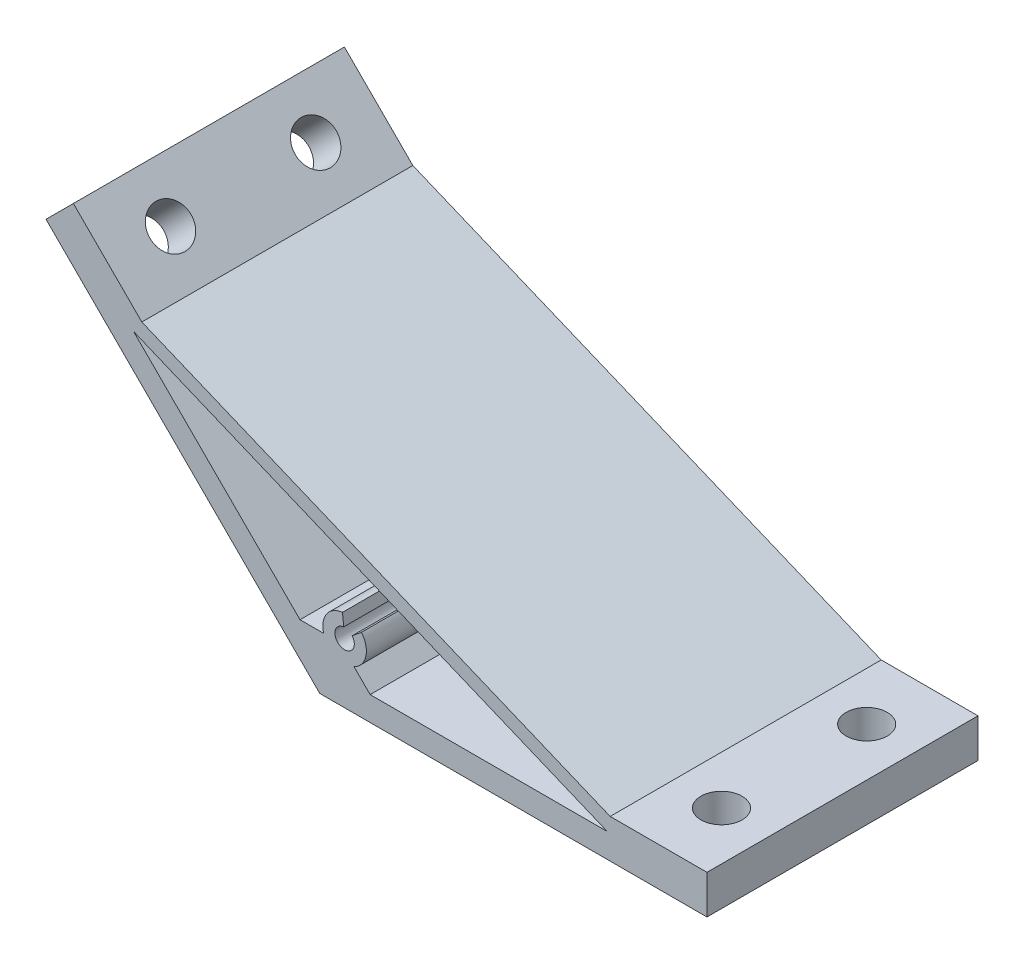
ISO-10303-21;
HEADER;
FILE_DESCRIPTION(('STEP AP214'),'2;1');
FILE_NAME('part.step','',(''),(''),'','','');
FILE_SCHEMA(('AUTOMOTIVE_DESIGN { 1 0 10303 214 1 1 1 1 }'));
ENDSEC;
DATA;
#1=APPLICATION_CONTEXT('core data for automotive mechanical design processes');
#2=APPLICATION_PROTOCOL_DEFINITION('international standard','automotive_design',2000,#1);
#3=PRODUCT_CONTEXT('',#1,'mechanical');
#4=PRODUCT('Part','Part','',(#3));
#5=PRODUCT_RELATED_PRODUCT_CATEGORY('part','',(#4));
#6=PRODUCT_DEFINITION_FORMATION('','',#4);
#7=PRODUCT_DEFINITION_CONTEXT('part definition',#1,'design');
#8=PRODUCT_DEFINITION('design','',#6,#7);
#9=PRODUCT_DEFINITION_SHAPE('','',#8);
#10=(LENGTH_UNIT() NAMED_UNIT(*) SI_UNIT(.MILLI.,.METRE.));
#11=(NAMED_UNIT(*) PLANE_ANGLE_UNIT() SI_UNIT($,.RADIAN.));
#12=(NAMED_UNIT(*) SI_UNIT($,.STERADIAN.) SOLID_ANGLE_UNIT());
#13=UNCERTAINTY_MEASURE_WITH_UNIT(LENGTH_MEASURE(1.E-05),#10,'distance_accuracy_value','');
#14=(GEOMETRIC_REPRESENTATION_CONTEXT(3) GLOBAL_UNCERTAINTY_ASSIGNED_CONTEXT((#13)) GLOBAL_UNIT_ASSIGNED_CONTEXT((#10,
#11,#12)) REPRESENTATION_CONTEXT('',''));
#15=CARTESIAN_POINT('',(0.,0.,0.));
#16=DIRECTION('',(0.,0.,1.));
#17=DIRECTION('',(1.,0.,0.));
#18=AXIS2_PLACEMENT_3D('',#15,#16,#17);
#19=CARTESIAN_POINT('',(580.06230191566,1400.39427630612,28.));
#20=DIRECTION('',(0.382683432365095,0.923879532511285,0.));
#21=DIRECTION('',(-0.923879532511285,0.382683432365095,0.));
#22=AXIS2_PLACEMENT_3D('',#19,#20,#21);
#23=PLANE('',#22);
#24=DIRECTION('',(0.923879532511285,-0.382683432365095,0.));
#25=VECTOR('',#24,1.);
#26=CARTESIAN_POINT('',(580.06230191566,1400.39427630612,-28.));
#27=LINE('',#26,#25);
#28=CARTESIAN_POINT('',(6955.91811216156,-1240.57167203307,-28.));
#29=VERTEX_POINT('',#28);
#30=CARTESIAN_POINT('',(7052.68766478326,-1280.65493315376,-28.));
#31=VERTEX_POINT('',#30);
#32=EDGE_CURVE('E296',#29,#31,#27,.T.);
#33=ORIENTED_EDGE('',*,*,#32,.F.);
#34=DIRECTION('',(0.,0.,-1.));
#35=VECTOR('',#34,1.);
#36=CARTESIAN_POINT('',(6955.91811216156,-1240.57167203307,28.));
#37=LINE('',#36,#35);
#38=CARTESIAN_POINT('',(6955.91811216156,-1240.57167203307,28.));
#39=VERTEX_POINT('',#38);
#40=EDGE_CURVE('E11',#39,#29,#37,.T.);
#41=ORIENTED_EDGE('',*,*,#40,.F.);
#42=DIRECTION('',(0.923879532511285,-0.382683432365095,0.));
#43=VECTOR('',#42,1.);
#44=CARTESIAN_POINT('',(580.06230191566,1400.39427630612,28.));
#45=LINE('',#44,#43);
#46=CARTESIAN_POINT('',(7052.68766478326,-1280.65493315376,28.));
#47=VERTEX_POINT('',#46);
#48=EDGE_CURVE('E261',#39,#47,#45,.T.);
#49=ORIENTED_EDGE('',*,*,#48,.T.);
#50=DIRECTION('',(0.,0.,-1.));
#51=VECTOR('',#50,1.);
#52=CARTESIAN_POINT('',(7052.68766478326,-1280.65493315376,28.));
#53=LINE('',#52,#51);
#54=EDGE_CURVE('E54',#47,#31,#53,.T.);
#55=ORIENTED_EDGE('',*,*,#54,.T.);
#56=EDGE_LOOP('',(#33,#41,#49,#55));
#57=FACE_BOUND('',#56,.T.);
#58=ADVANCED_FACE('F35',(#57),#23,.T.);
#59=CARTESIAN_POINT('',(2857.67322006435,2857.67322006426,28.));
#60=DIRECTION('',(-0.707106781186559,-0.707106781186536,0.));
#61=DIRECTION('',(0.707106781186536,-0.707106781186559,0.));
#62=AXIS2_PLACEMENT_3D('',#59,#60,#61);
#63=PLANE('',#62);
#64=CARTESIAN_POINT('',(6948.84704434969,-1233.50060422121,-15.));
#65=DIRECTION('',(-0.707106781186559,-0.707106781186536,0.));
#66=DIRECTION('',(0.707106781186536,-0.707106781186559,0.));
#67=AXIS2_PLACEMENT_3D('',#64,#65,#66);
#68=CIRCLE('',#67,4.24999999999998);
#69=CARTESIAN_POINT('',(6951.85224816974,-1236.50580804125,-15.));
#70=VERTEX_POINT('',#69);
#71=EDGE_CURVE('E215',#70,#70,#68,.T.);
#72=ORIENTED_EDGE('',*,*,#71,.T.);
#73=EDGE_LOOP('',(#72));
#74=FACE_BOUND('',#73,.T.);
#75=CARTESIAN_POINT('',(6948.84704434969,-1233.50060422121,15.));
#76=DIRECTION('',(-0.707106781186559,-0.707106781186536,0.));
#77=DIRECTION('',(0.707106781186536,-0.707106781186559,0.));
#78=AXIS2_PLACEMENT_3D('',#75,#76,#77);
#79=CIRCLE('',#78,4.24999999999998);
#80=CARTESIAN_POINT('',(6951.85224816974,-1236.50580804125,15.));
#81=VERTEX_POINT('',#80);
#82=EDGE_CURVE('E222',#81,#81,#79,.T.);
#83=ORIENTED_EDGE('',*,*,#82,.T.);
#84=EDGE_LOOP('',(#83));
#85=FACE_BOUND('',#84,.T.);
#86=DIRECTION('',(-0.707106781186536,0.707106781186559,0.));
#87=VECTOR('',#86,1.);
#88=CARTESIAN_POINT('',(2857.67322006435,2857.67322006426,-28.));
#89=LINE('',#88,#87);
#90=CARTESIAN_POINT('',(6941.77597653783,-1226.42953640934,-28.));
#91=VERTEX_POINT('',#90);
#92=EDGE_CURVE('E298',#29,#91,#89,.T.);
#93=ORIENTED_EDGE('',*,*,#92,.T.);
#94=DIRECTION('',(0.,0.,-1.));
#95=VECTOR('',#94,1.);
#96=CARTESIAN_POINT('',(6941.77597653783,-1226.42953640934,28.));
#97=LINE('',#96,#95);
#98=CARTESIAN_POINT('',(6941.77597653783,-1226.42953640934,28.));
#99=VERTEX_POINT('',#98);
#100=EDGE_CURVE('E45',#99,#91,#97,.T.);
#101=ORIENTED_EDGE('',*,*,#100,.F.);
#102=DIRECTION('',(-0.707106781186536,0.707106781186559,0.));
#103=VECTOR('',#102,1.);
#104=CARTESIAN_POINT('',(2857.67322006435,2857.67322006426,28.));
#105=LINE('',#104,#103);
#106=EDGE_CURVE('E263',#39,#99,#105,.T.);
#107=ORIENTED_EDGE('',*,*,#106,.F.);
#108=ORIENTED_EDGE('',*,*,#40,.T.);
#109=EDGE_LOOP('',(#93,#101,#107,#108));
#110=FACE_BOUND('',#109,.T.);
#111=ADVANCED_FACE('F333',(#74,#85,#110),#63,.F.);
#112=CARTESIAN_POINT('',(4084.10275647372,-4084.10275647356,28.));
#113=DIRECTION('',(-0.707106781186561,0.707106781186534,0.));
#114=DIRECTION('',(-0.707106781186534,-0.707106781186561,0.));
#115=AXIS2_PLACEMENT_3D('',#112,#113,#114);
#116=PLANE('',#115);
#117=DIRECTION('',(0.707106781186534,0.707106781186561,0.));
#118=VECTOR('',#117,1.);
#119=CARTESIAN_POINT('',(4084.10275647372,-4084.10275647356,-28.));
#120=LINE('',#119,#118);
#121=CARTESIAN_POINT('',(6936.11912228834,-1232.08639065884,-28.));
#122=VERTEX_POINT('',#121);
#123=EDGE_CURVE('E301',#122,#91,#120,.T.);
#124=ORIENTED_EDGE('',*,*,#123,.F.);
#125=DIRECTION('',(0.,0.,-1.));
#126=VECTOR('',#125,1.);
#127=CARTESIAN_POINT('',(6936.11912228834,-1232.08639065884,28.));
#128=LINE('',#127,#126);
#129=CARTESIAN_POINT('',(6936.11912228834,-1232.08639065884,28.));
#130=VERTEX_POINT('',#129);
#131=EDGE_CURVE('E187',#130,#122,#128,.T.);
#132=ORIENTED_EDGE('',*,*,#131,.F.);
#133=DIRECTION('',(0.707106781186534,0.707106781186561,0.));
#134=VECTOR('',#133,1.);
#135=CARTESIAN_POINT('',(4084.10275647372,-4084.10275647356,28.));
#136=LINE('',#135,#134);
#137=EDGE_CURVE('E265',#130,#99,#136,.T.);
#138=ORIENTED_EDGE('',*,*,#137,.T.);
#139=ORIENTED_EDGE('',*,*,#100,.T.);
#140=EDGE_LOOP('',(#124,#132,#138,#139));
#141=FACE_BOUND('',#140,.T.);
#142=ADVANCED_FACE('F338',(#141),#116,.T.);
#143=CARTESIAN_POINT('',(2852.0163658146,2852.01636581472,28.));
#144=DIRECTION('',(-0.707106781186532,-0.707106781186563,0.));
#145=DIRECTION('',(0.707106781186563,-0.707106781186532,0.));
#146=AXIS2_PLACEMENT_3D('',#143,#144,#145);
#147=PLANE('',#146);
#148=CARTESIAN_POINT('',(6943.1901901002,-1239.1574584707,-15.));
#149=DIRECTION('',(-0.707106781186532,-0.707106781186563,0.));
#150=DIRECTION('',(0.707106781186563,-0.707106781186532,0.));
#151=AXIS2_PLACEMENT_3D('',#148,#149,#150);
#152=CIRCLE('',#151,4.24999999999999);
#153=CARTESIAN_POINT('',(6946.19539392024,-1242.16266229074,-15.));
#154=VERTEX_POINT('',#153);
#155=EDGE_CURVE('E218',#154,#154,#152,.T.);
#156=ORIENTED_EDGE('',*,*,#155,.F.);
#157=EDGE_LOOP('',(#156));
#158=FACE_BOUND('',#157,.T.);
#159=CARTESIAN_POINT('',(6943.1901901002,-1239.1574584707,15.));
#160=DIRECTION('',(-0.707106781186532,-0.707106781186563,0.));
#161=DIRECTION('',(0.707106781186563,-0.707106781186532,0.));
#162=AXIS2_PLACEMENT_3D('',#159,#160,#161);
#163=CIRCLE('',#162,4.24999999999999);
#164=CARTESIAN_POINT('',(6946.19539392024,-1242.16266229074,15.));
#165=VERTEX_POINT('',#164);
#166=EDGE_CURVE('E217',#165,#165,#163,.T.);
#167=ORIENTED_EDGE('',*,*,#166,.F.);
#168=EDGE_LOOP('',(#167));
#169=FACE_BOUND('',#168,.T.);
#170=DIRECTION('',(-0.707106781186563,0.707106781186532,0.));
#171=VECTOR('',#170,1.);
#172=CARTESIAN_POINT('',(2852.0163658146,2852.01636581472,-28.));
#173=LINE('',#172,#171);
#174=CARTESIAN_POINT('',(6992.68766478326,-1288.65493315376,-28.));
#175=VERTEX_POINT('',#174);
#176=EDGE_CURVE('E304',#175,#122,#173,.T.);
#177=ORIENTED_EDGE('',*,*,#176,.F.);
#178=DIRECTION('',(0.,0.,-1.));
#179=VECTOR('',#178,1.);
#180=CARTESIAN_POINT('',(6992.68766478326,-1288.65493315376,28.));
#181=LINE('',#180,#179);
#182=CARTESIAN_POINT('',(6992.68766478326,-1288.65493315376,28.));
#183=VERTEX_POINT('',#182);
#184=EDGE_CURVE('E185',#183,#175,#181,.T.);
#185=ORIENTED_EDGE('',*,*,#184,.F.);
#186=DIRECTION('',(-0.707106781186563,0.707106781186532,0.));
#187=VECTOR('',#186,1.);
#188=CARTESIAN_POINT('',(2852.0163658146,2852.01636581472,28.));
#189=LINE('',#188,#187);
#190=EDGE_CURVE('E179',#183,#130,#189,.T.);
#191=ORIENTED_EDGE('',*,*,#190,.T.);
#192=ORIENTED_EDGE('',*,*,#131,.T.);
#193=EDGE_LOOP('',(#177,#185,#191,#192));
#194=FACE_BOUND('',#193,.T.);
#195=ADVANCED_FACE('F431',(#158,#169,#194),#147,.T.);
#196=CARTESIAN_POINT('',(0.,-1288.65493315376,28.));
#197=DIRECTION('',(0.,1.,0.));
#198=DIRECTION('',(0.,0.,1.));
#199=AXIS2_PLACEMENT_3D('',#196,#197,#198);
#200=PLANE('',#199);
#201=CARTESIAN_POINT('',(7062.68766478326,-1288.65493315377,-15.));
#202=DIRECTION('',(0.,-1.,0.));
#203=DIRECTION('',(0.,0.,-1.));
#204=AXIS2_PLACEMENT_3D('',#201,#202,#203);
#205=CIRCLE('',#204,4.24999999999986);
#206=CARTESIAN_POINT('',(7062.68766478326,-1288.65493315377,-19.2499999999999));
#207=VERTEX_POINT('',#206);
#208=EDGE_CURVE('E423',#207,#207,#205,.T.);
#209=ORIENTED_EDGE('',*,*,#208,.F.);
#210=EDGE_LOOP('',(#209));
#211=FACE_BOUND('',#210,.T.);
#212=CARTESIAN_POINT('',(7062.68766478326,-1288.65493315377,15.));
#213=DIRECTION('',(0.,-1.,0.));
#214=DIRECTION('',(0.,0.,-1.));
#215=AXIS2_PLACEMENT_3D('',#212,#213,#214);
#216=CIRCLE('',#215,4.24999999999986);
#217=CARTESIAN_POINT('',(7062.68766478326,-1288.65493315377,10.7500000000001));
#218=VERTEX_POINT('',#217);
#219=EDGE_CURVE('E230',#218,#218,#216,.T.);
#220=ORIENTED_EDGE('',*,*,#219,.F.);
#221=EDGE_LOOP('',(#220));
#222=FACE_BOUND('',#221,.T.);
#223=DIRECTION('',(1.,0.,0.));
#224=VECTOR('',#223,1.);
#225=CARTESIAN_POINT('',(0.,-1288.65493315376,-28.));
#226=LINE('',#225,#224);
#227=CARTESIAN_POINT('',(7072.68766478326,-1288.65493315376,-28.));
#228=VERTEX_POINT('',#227);
#229=EDGE_CURVE('E184',#175,#228,#226,.T.);
#230=ORIENTED_EDGE('',*,*,#229,.T.);
#231=DIRECTION('',(0.,0.,-1.));
#232=VECTOR('',#231,1.);
#233=CARTESIAN_POINT('',(7072.68766478326,-1288.65493315376,28.));
#234=LINE('',#233,#232);
#235=CARTESIAN_POINT('',(7072.68766478326,-1288.65493315376,28.));
#236=VERTEX_POINT('',#235);
#237=EDGE_CURVE('E166',#236,#228,#234,.T.);
#238=ORIENTED_EDGE('',*,*,#237,.F.);
#239=DIRECTION('',(1.,0.,0.));
#240=VECTOR('',#239,1.);
#241=CARTESIAN_POINT('',(0.,-1288.65493315376,28.));
#242=LINE('',#241,#240);
#243=EDGE_CURVE('E171',#183,#236,#242,.T.);
#244=ORIENTED_EDGE('',*,*,#243,.F.);
#245=ORIENTED_EDGE('',*,*,#184,.T.);
#246=EDGE_LOOP('',(#230,#238,#244,#245));
#247=FACE_BOUND('',#246,.T.);
#248=ADVANCED_FACE('F182',(#211,#222,#247),#200,.F.);
#249=CARTESIAN_POINT('',(7072.68766478326,0.,28.));
#250=DIRECTION('',(-1.,0.,0.));
#251=DIRECTION('',(0.,0.,1.));
#252=AXIS2_PLACEMENT_3D('',#249,#250,#251);
#253=PLANE('',#252);
#254=DIRECTION('',(0.,1.,0.));
#255=VECTOR('',#254,1.);
#256=CARTESIAN_POINT('',(7072.68766478326,0.,-28.));
#257=LINE('',#256,#255);
#258=CARTESIAN_POINT('',(7072.68766478326,-1280.65493315376,-28.));
#259=VERTEX_POINT('',#258);
#260=EDGE_CURVE('E308',#228,#259,#257,.T.);
#261=ORIENTED_EDGE('',*,*,#260,.T.);
#262=DIRECTION('',(0.,0.,-1.));
#263=VECTOR('',#262,1.);
#264=CARTESIAN_POINT('',(7072.68766478326,-1280.65493315376,28.));
#265=LINE('',#264,#263);
#266=CARTESIAN_POINT('',(7072.68766478326,-1280.65493315376,28.));
#267=VERTEX_POINT('',#266);
#268=EDGE_CURVE('E107',#267,#259,#265,.T.);
#269=ORIENTED_EDGE('',*,*,#268,.F.);
#270=DIRECTION('',(0.,1.,0.));
#271=VECTOR('',#270,1.);
#272=CARTESIAN_POINT('',(7072.68766478326,0.,28.));
#273=LINE('',#272,#271);
#274=EDGE_CURVE('E162',#236,#267,#273,.T.);
#275=ORIENTED_EDGE('',*,*,#274,.F.);
#276=ORIENTED_EDGE('',*,*,#237,.T.);
#277=EDGE_LOOP('',(#261,#269,#275,#276));
#278=FACE_BOUND('',#277,.T.);
#279=ADVANCED_FACE('F164',(#278),#253,.F.);
#280=CARTESIAN_POINT('',(6997.82073881189,-1276.26412007604,28.));
#281=DIRECTION('',(0.,0.,-1.));
#282=DIRECTION('',(-1.,0.,0.));
#283=AXIS2_PLACEMENT_3D('',#280,#281,#282);
#284=CYLINDRICAL_SURFACE('',#283,1.99999999999993);
#285=CARTESIAN_POINT('',(6997.82073881189,-1276.26412007604,-28.));
#286=DIRECTION('',(0.,0.,1.));
#287=DIRECTION('',(1.,0.,0.));
#288=AXIS2_PLACEMENT_3D('',#285,#286,#287);
#289=CIRCLE('',#288,1.99999999999993);
#290=CARTESIAN_POINT('',(6997.62653003943,-1274.27357167103,-28.));
#291=VERTEX_POINT('',#290);
#292=CARTESIAN_POINT('',(6999.36559542733,-1274.99391614055,-28.));
#293=VERTEX_POINT('',#292);
#294=EDGE_CURVE('E236',#291,#293,#289,.T.);
#295=ORIENTED_EDGE('',*,*,#294,.F.);
#296=DIRECTION('',(0.,0.,-1.));
#297=VECTOR('',#296,1.);
#298=CARTESIAN_POINT('',(6997.62653003943,-1274.27357167103,28.));
#299=LINE('',#298,#297);
#300=CARTESIAN_POINT('',(6997.62653003943,-1274.27357167103,28.));
#301=VERTEX_POINT('',#300);
#302=EDGE_CURVE('E119',#301,#291,#299,.T.);
#303=ORIENTED_EDGE('',*,*,#302,.F.);
#304=CARTESIAN_POINT('',(6997.82073881189,-1276.26412007604,28.));
#305=DIRECTION('',(0.,0.,1.));
#306=DIRECTION('',(1.,0.,0.));
#307=AXIS2_PLACEMENT_3D('',#304,#305,#306);
#308=CIRCLE('',#307,1.99999999999993);
#309=CARTESIAN_POINT('',(6999.36559542733,-1274.99391614055,28.));
#310=VERTEX_POINT('',#309);
#311=EDGE_CURVE('E237',#301,#310,#308,.T.);
#312=ORIENTED_EDGE('',*,*,#311,.T.);
#313=DIRECTION('',(0.,0.,-1.));
#314=VECTOR('',#313,1.);
#315=CARTESIAN_POINT('',(6999.36559542733,-1274.99391614055,28.));
#316=LINE('',#315,#314);
#317=EDGE_CURVE('E194',#310,#293,#316,.T.);
#318=ORIENTED_EDGE('',*,*,#317,.T.);
#319=EDGE_LOOP('',(#295,#303,#312,#318));
#320=FACE_BOUND('',#319,.T.);
#321=ADVANCED_FACE('F37',(#320),#284,.F.);
#322=CARTESIAN_POINT('',(6808.49128288336,664.273589646761,28.));
#323=DIRECTION('',(-0.9952742025064,-0.0971043862307417,0.));
#324=DIRECTION('',(0.0971043862307417,-0.9952742025064,0.));
#325=AXIS2_PLACEMENT_3D('',#322,#323,#324);
#326=PLANE('',#325);
#327=DIRECTION('',(-0.0971043862307417,0.9952742025064,0.));
#328=VECTOR('',#327,1.);
#329=CARTESIAN_POINT('',(6808.49128288336,664.273589646761,-28.));
#330=LINE('',#329,#328);
#331=CARTESIAN_POINT('',(6997.38376907385,-1271.78538616476,-28.));
#332=VERTEX_POINT('',#331);
#333=EDGE_CURVE('E272',#291,#332,#330,.T.);
#334=ORIENTED_EDGE('',*,*,#333,.T.);
#335=DIRECTION('',(0.,0.,-1.));
#336=VECTOR('',#335,1.);
#337=CARTESIAN_POINT('',(6997.38376907385,-1271.78538616476,28.));
#338=LINE('',#337,#336);
#339=CARTESIAN_POINT('',(6997.38376907385,-1271.78538616476,28.));
#340=VERTEX_POINT('',#339);
#341=EDGE_CURVE('E212',#340,#332,#338,.T.);
#342=ORIENTED_EDGE('',*,*,#341,.F.);
#343=DIRECTION('',(-0.0971043862307417,0.9952742025064,0.));
#344=VECTOR('',#343,1.);
#345=CARTESIAN_POINT('',(6808.49128288336,664.273589646761,28.));
#346=LINE('',#345,#344);
#347=EDGE_CURVE('E239',#301,#340,#346,.T.);
#348=ORIENTED_EDGE('',*,*,#347,.F.);
#349=ORIENTED_EDGE('',*,*,#302,.T.);
#350=EDGE_LOOP('',(#334,#342,#348,#349));
#351=FACE_BOUND('',#350,.T.);
#352=ADVANCED_FACE('F367',(#351),#326,.F.);
#353=CARTESIAN_POINT('',(6997.82073881189,-1276.26412007604,28.));
#354=DIRECTION('',(0.,0.,-1.));
#355=DIRECTION('',(-1.,0.,0.));
#356=AXIS2_PLACEMENT_3D('',#353,#354,#355);
#357=CYLINDRICAL_SURFACE('',#356,4.49999999999951);
#358=CARTESIAN_POINT('',(6997.82073881189,-1276.26412007604,-28.));
#359=DIRECTION('',(0.,0.,1.));
#360=DIRECTION('',(1.,0.,0.));
#361=AXIS2_PLACEMENT_3D('',#358,#359,#360);
#362=CIRCLE('',#361,4.49999999999951);
#363=CARTESIAN_POINT('',(6993.49338103034,-1277.49861374974,-28.));
#364=VERTEX_POINT('',#363);
#365=EDGE_CURVE('E274',#332,#364,#362,.T.);
#366=ORIENTED_EDGE('',*,*,#365,.T.);
#367=DIRECTION('',(0.,0.,-1.));
#368=VECTOR('',#367,1.);
#369=CARTESIAN_POINT('',(6993.49338103034,-1277.49861374974,28.));
#370=LINE('',#369,#368);
#371=CARTESIAN_POINT('',(6993.49338103034,-1277.49861374974,28.));
#372=VERTEX_POINT('',#371);
#373=EDGE_CURVE('E210',#372,#364,#370,.T.);
#374=ORIENTED_EDGE('',*,*,#373,.F.);
#375=CARTESIAN_POINT('',(6997.82073881189,-1276.26412007604,28.));
#376=DIRECTION('',(0.,0.,1.));
#377=DIRECTION('',(1.,0.,0.));
#378=AXIS2_PLACEMENT_3D('',#375,#376,#377);
#379=CIRCLE('',#378,4.49999999999951);
#380=EDGE_CURVE('E242',#340,#372,#379,.T.);
#381=ORIENTED_EDGE('',*,*,#380,.F.);
#382=ORIENTED_EDGE('',*,*,#341,.T.);
#383=EDGE_LOOP('',(#366,#374,#381,#382));
#384=FACE_BOUND('',#383,.T.);
#385=ADVANCED_FACE('F364',(#384),#357,.T.);
#386=CARTESIAN_POINT('',(1.15994087185971E-09,-1277.49861375609,28.));
#387=DIRECTION('',(-9.079781843749E-13,1.,0.));
#388=DIRECTION('',(-1.,-9.079781843749E-13,0.));
#389=AXIS2_PLACEMENT_3D('',#386,#387,#388);
#390=PLANE('',#389);
#391=DIRECTION('',(1.,9.079781843749E-13,0.));
#392=VECTOR('',#391,1.);
#393=CARTESIAN_POINT('',(1.15994087185971E-09,-1277.49861375609,-28.));
#394=LINE('',#393,#392);
#395=CARTESIAN_POINT('',(6988.60241319111,-1277.49861374974,-28.));
#396=VERTEX_POINT('',#395);
#397=EDGE_CURVE('E277',#396,#364,#394,.T.);
#398=ORIENTED_EDGE('',*,*,#397,.F.);
#399=DIRECTION('',(0.,0.,-1.));
#400=VECTOR('',#399,1.);
#401=CARTESIAN_POINT('',(6988.60241319111,-1277.49861374974,28.));
#402=LINE('',#401,#400);
#403=CARTESIAN_POINT('',(6988.60241319111,-1277.49861374974,28.));
#404=VERTEX_POINT('',#403);
#405=EDGE_CURVE('E208',#404,#396,#402,.T.);
#406=ORIENTED_EDGE('',*,*,#405,.F.);
#407=DIRECTION('',(1.,9.079781843749E-13,0.));
#408=VECTOR('',#407,1.);
#409=CARTESIAN_POINT('',(1.15994087185971E-09,-1277.49861375609,28.));
#410=LINE('',#409,#408);
#411=EDGE_CURVE('E244',#404,#372,#410,.T.);
#412=ORIENTED_EDGE('',*,*,#411,.T.);
#413=ORIENTED_EDGE('',*,*,#373,.T.);
#414=EDGE_LOOP('',(#398,#406,#412,#413));
#415=FACE_BOUND('',#414,.T.);
#416=ADVANCED_FACE('F360',(#415),#390,.T.);
#417=CARTESIAN_POINT('',(2855.55189972073,2855.55189972069,28.));
#418=DIRECTION('',(-0.707106781186552,-0.707106781186543,0.));
#419=DIRECTION('',(0.707106781186543,-0.707106781186552,0.));
#420=AXIS2_PLACEMENT_3D('',#417,#418,#419);
#421=PLANE('',#420);
#422=DIRECTION('',(-0.707106781186543,0.707106781186552,0.));
#423=VECTOR('',#422,1.);
#424=CARTESIAN_POINT('',(2855.55189972073,2855.55189972069,-28.));
#425=LINE('',#424,#423);
#426=CARTESIAN_POINT('',(6954.21874866951,-1243.11494922814,-28.));
#427=VERTEX_POINT('',#426);
#428=EDGE_CURVE('E280',#396,#427,#425,.T.);
#429=ORIENTED_EDGE('',*,*,#428,.T.);
#430=DIRECTION('',(0.,0.,-1.));
#431=VECTOR('',#430,1.);
#432=CARTESIAN_POINT('',(6954.21874866951,-1243.11494922814,28.));
#433=LINE('',#432,#431);
#434=CARTESIAN_POINT('',(6954.21874866951,-1243.11494922814,28.));
#435=VERTEX_POINT('',#434);
#436=EDGE_CURVE('E205',#435,#427,#433,.T.);
#437=ORIENTED_EDGE('',*,*,#436,.F.);
#438=DIRECTION('',(-0.707106781186543,0.707106781186552,0.));
#439=VECTOR('',#438,1.);
#440=CARTESIAN_POINT('',(2855.55189972073,2855.55189972069,28.));
#441=LINE('',#440,#439);
#442=EDGE_CURVE('E247',#404,#435,#441,.T.);
#443=ORIENTED_EDGE('',*,*,#442,.F.);
#444=ORIENTED_EDGE('',*,*,#405,.T.);
#445=EDGE_LOOP('',(#429,#437,#443,#444));
#446=FACE_BOUND('',#445,.T.);
#447=ADVANCED_FACE('F356',(#446),#421,.F.);
#448=CARTESIAN_POINT('',(578.914251618586,1397.62263770862,28.));
#449=DIRECTION('',(0.3826834323651,0.923879532511283,0.));
#450=DIRECTION('',(-0.923879532511283,0.3826834323651,0.));
#451=AXIS2_PLACEMENT_3D('',#448,#449,#450);
#452=PLANE('',#451);
#453=DIRECTION('',(0.923879532511283,-0.3826834323651,0.));
#454=VECTOR('',#453,1.);
#455=CARTESIAN_POINT('',(578.914251618586,1397.62263770862,-28.));
#456=LINE('',#455,#454);
#457=CARTESIAN_POINT('',(7052.09092768112,-1283.65493315376,-28.));
#458=VERTEX_POINT('',#457);
#459=EDGE_CURVE('E282',#427,#458,#456,.T.);
#460=ORIENTED_EDGE('',*,*,#459,.T.);
#461=DIRECTION('',(0.,0.,-1.));
#462=VECTOR('',#461,1.);
#463=CARTESIAN_POINT('',(7052.09092768112,-1283.65493315376,28.));
#464=LINE('',#463,#462);
#465=CARTESIAN_POINT('',(7052.09092768112,-1283.65493315376,28.));
#466=VERTEX_POINT('',#465);
#467=EDGE_CURVE('E203',#466,#458,#464,.T.);
#468=ORIENTED_EDGE('',*,*,#467,.F.);
#469=DIRECTION('',(0.923879532511283,-0.3826834323651,0.));
#470=VECTOR('',#469,1.);
#471=CARTESIAN_POINT('',(578.914251618586,1397.62263770862,28.));
#472=LINE('',#471,#470);
#473=EDGE_CURVE('E249',#435,#466,#472,.T.);
#474=ORIENTED_EDGE('',*,*,#473,.F.);
#475=ORIENTED_EDGE('',*,*,#436,.T.);
#476=EDGE_LOOP('',(#460,#468,#474,#475));
#477=FACE_BOUND('',#476,.T.);
#478=ADVANCED_FACE('F352',(#477),#452,.F.);
#479=CARTESIAN_POINT('',(-5.8169112753506E-12,-1283.65493315373,28.));
#480=DIRECTION('',(0.,1.,0.));
#481=DIRECTION('',(-1.,0.,0.));
#482=AXIS2_PLACEMENT_3D('',#479,#480,#481);
#483=PLANE('',#482);
#484=DIRECTION('',(1.,0.,0.));
#485=VECTOR('',#484,1.);
#486=CARTESIAN_POINT('',(-5.8169112753506E-12,-1283.65493315373,-28.));
#487=LINE('',#486,#485);
#488=CARTESIAN_POINT('',(7003.09092768112,-1283.65493315376,-28.));
#489=VERTEX_POINT('',#488);
#490=EDGE_CURVE('E285',#489,#458,#487,.T.);
#491=ORIENTED_EDGE('',*,*,#490,.F.);
#492=DIRECTION('',(0.,0.,-1.));
#493=VECTOR('',#492,1.);
#494=CARTESIAN_POINT('',(7003.09092768112,-1283.65493315376,28.));
#495=LINE('',#494,#493);
#496=CARTESIAN_POINT('',(7003.09092768112,-1283.65493315376,28.));
#497=VERTEX_POINT('',#496);
#498=EDGE_CURVE('E201',#497,#489,#495,.T.);
#499=ORIENTED_EDGE('',*,*,#498,.F.);
#500=DIRECTION('',(1.,0.,0.));
#501=VECTOR('',#500,1.);
#502=CARTESIAN_POINT('',(-5.8169112753506E-12,-1283.65493315373,28.));
#503=LINE('',#502,#501);
#504=EDGE_CURVE('E251',#497,#466,#503,.T.);
#505=ORIENTED_EDGE('',*,*,#504,.T.);
#506=ORIENTED_EDGE('',*,*,#467,.T.);
#507=EDGE_LOOP('',(#491,#499,#505,#506));
#508=FACE_BOUND('',#507,.T.);
#509=ADVANCED_FACE('F348',(#508),#483,.T.);
#510=CARTESIAN_POINT('',(2859.71799726508,2859.71799726394,28.));
#511=DIRECTION('',(-0.707106781186689,-0.707106781186406,0.));
#512=DIRECTION('',(0.707106781186406,-0.707106781186689,0.));
#513=AXIS2_PLACEMENT_3D('',#510,#511,#512);
#514=PLANE('',#513);
#515=DIRECTION('',(-0.707106781186406,0.707106781186689,0.));
#516=VECTOR('',#515,1.);
#517=CARTESIAN_POINT('',(2859.71799726508,2859.71799726394,-28.));
#518=LINE('',#517,#516);
#519=CARTESIAN_POINT('',(6999.76054974539,-1280.32455521803,-28.));
#520=VERTEX_POINT('',#519);
#521=EDGE_CURVE('E288',#489,#520,#518,.T.);
#522=ORIENTED_EDGE('',*,*,#521,.T.);
#523=DIRECTION('',(0.,0.,-1.));
#524=VECTOR('',#523,1.);
#525=CARTESIAN_POINT('',(6999.76054974539,-1280.32455521803,28.));
#526=LINE('',#525,#524);
#527=CARTESIAN_POINT('',(6999.76054974539,-1280.32455521803,28.));
#528=VERTEX_POINT('',#527);
#529=EDGE_CURVE('E198',#528,#520,#526,.T.);
#530=ORIENTED_EDGE('',*,*,#529,.F.);
#531=DIRECTION('',(-0.707106781186406,0.707106781186689,0.));
#532=VECTOR('',#531,1.);
#533=CARTESIAN_POINT('',(2859.71799726508,2859.71799726394,28.));
#534=LINE('',#533,#532);
#535=EDGE_CURVE('E254',#497,#528,#534,.T.);
#536=ORIENTED_EDGE('',*,*,#535,.F.);
#537=ORIENTED_EDGE('',*,*,#498,.T.);
#538=EDGE_LOOP('',(#522,#530,#536,#537));
#539=FACE_BOUND('',#538,.T.);
#540=ADVANCED_FACE('F344',(#539),#514,.F.);
#541=CARTESIAN_POINT('',(6997.82073881189,-1276.26412007604,28.));
#542=DIRECTION('',(0.,0.,-1.));
#543=DIRECTION('',(-1.,0.,0.));
#544=AXIS2_PLACEMENT_3D('',#541,#542,#543);
#545=CYLINDRICAL_SURFACE('',#544,4.50000000000019);
#546=CARTESIAN_POINT('',(6997.82073881189,-1276.26412007604,-28.));
#547=DIRECTION('',(0.,0.,1.));
#548=DIRECTION('',(1.,0.,0.));
#549=AXIS2_PLACEMENT_3D('',#546,#547,#548);
#550=CIRCLE('',#549,4.50000000000019);
#551=CARTESIAN_POINT('',(7001.29666619663,-1273.40616122119,-28.));
#552=VERTEX_POINT('',#551);
#553=EDGE_CURVE('E290',#520,#552,#550,.T.);
#554=ORIENTED_EDGE('',*,*,#553,.T.);
#555=DIRECTION('',(0.,0.,-1.));
#556=VECTOR('',#555,1.);
#557=CARTESIAN_POINT('',(7001.29666619663,-1273.40616122119,28.));
#558=LINE('',#557,#556);
#559=CARTESIAN_POINT('',(7001.29666619663,-1273.40616122119,28.));
#560=VERTEX_POINT('',#559);
#561=EDGE_CURVE('E196',#560,#552,#558,.T.);
#562=ORIENTED_EDGE('',*,*,#561,.F.);
#563=CARTESIAN_POINT('',(6997.82073881189,-1276.26412007604,28.));
#564=DIRECTION('',(0.,0.,1.));
#565=DIRECTION('',(1.,0.,0.));
#566=AXIS2_PLACEMENT_3D('',#563,#564,#565);
#567=CIRCLE('',#566,4.50000000000019);
#568=EDGE_CURVE('E256',#528,#560,#567,.T.);
#569=ORIENTED_EDGE('',*,*,#568,.F.);
#570=ORIENTED_EDGE('',*,*,#529,.T.);
#571=EDGE_LOOP('',(#554,#562,#569,#570));
#572=FACE_BOUND('',#571,.T.);
#573=ADVANCED_FACE('F325',(#572),#545,.T.);
#574=CARTESIAN_POINT('',(3448.70038270471,-4194.40331746767,28.));
#575=DIRECTION('',(-0.63510196774562,0.772428307719002,0.));
#576=DIRECTION('',(-0.772428307719002,-0.63510196774562,0.));
#577=AXIS2_PLACEMENT_3D('',#574,#575,#576);
#578=PLANE('',#577);
#579=DIRECTION('',(0.772428307719002,0.63510196774562,0.));
#580=VECTOR('',#579,1.);
#581=CARTESIAN_POINT('',(3448.70038270471,-4194.40331746767,-28.));
#582=LINE('',#581,#580);
#583=EDGE_CURVE('E293',#293,#552,#582,.T.);
#584=ORIENTED_EDGE('',*,*,#583,.F.);
#585=ORIENTED_EDGE('',*,*,#317,.F.);
#586=DIRECTION('',(0.772428307719002,0.63510196774562,0.));
#587=VECTOR('',#586,1.);
#588=CARTESIAN_POINT('',(3448.70038270471,-4194.40331746767,28.));
#589=LINE('',#588,#587);
#590=EDGE_CURVE('E258',#310,#560,#589,.T.);
#591=ORIENTED_EDGE('',*,*,#590,.T.);
#592=ORIENTED_EDGE('',*,*,#561,.T.);
#593=EDGE_LOOP('',(#584,#585,#591,#592));
#594=FACE_BOUND('',#593,.T.);
#595=ADVANCED_FACE('F316',(#594),#578,.T.);
#596=CARTESIAN_POINT('',(0.,-1280.65493315376,28.));
#597=DIRECTION('',(0.,1.,0.));
#598=DIRECTION('',(0.,0.,1.));
#599=AXIS2_PLACEMENT_3D('',#596,#597,#598);
#600=PLANE('',#599);
#601=CARTESIAN_POINT('',(7062.68766478326,-1280.65493315376,-15.));
#602=DIRECTION('',(0.,1.,0.));
#603=DIRECTION('',(0.,0.,1.));
#604=AXIS2_PLACEMENT_3D('',#601,#602,#603);
#605=CIRCLE('',#604,4.24999999999986);
#606=CARTESIAN_POINT('',(7062.68766478326,-1280.65493315376,-10.7500000000001));
#607=VERTEX_POINT('',#606);
#608=EDGE_CURVE('E39',#607,#607,#605,.T.);
#609=ORIENTED_EDGE('',*,*,#608,.F.);
#610=EDGE_LOOP('',(#609));
#611=FACE_BOUND('',#610,.T.);
#612=CARTESIAN_POINT('',(7062.68766478326,-1280.65493315376,15.));
#613=DIRECTION('',(0.,1.,0.));
#614=DIRECTION('',(0.,0.,1.));
#615=AXIS2_PLACEMENT_3D('',#612,#613,#614);
#616=CIRCLE('',#615,4.24999999999986);
#617=CARTESIAN_POINT('',(7062.68766478326,-1280.65493315376,19.2499999999999));
#618=VERTEX_POINT('',#617);
#619=EDGE_CURVE('E225',#618,#618,#616,.T.);
#620=ORIENTED_EDGE('',*,*,#619,.F.);
#621=EDGE_LOOP('',(#620));
#622=FACE_BOUND('',#621,.T.);
#623=DIRECTION('',(1.,0.,0.));
#624=VECTOR('',#623,1.);
#625=CARTESIAN_POINT('',(0.,-1280.65493315376,-28.));
#626=LINE('',#625,#624);
#627=EDGE_CURVE('E240',#31,#259,#626,.T.);
#628=ORIENTED_EDGE('',*,*,#627,.F.);
#629=ORIENTED_EDGE('',*,*,#54,.F.);
#630=DIRECTION('',(1.,0.,0.));
#631=VECTOR('',#630,1.);
#632=CARTESIAN_POINT('',(0.,-1280.65493315376,28.));
#633=LINE('',#632,#631);
#634=EDGE_CURVE('E170',#47,#267,#633,.T.);
#635=ORIENTED_EDGE('',*,*,#634,.T.);
#636=ORIENTED_EDGE('',*,*,#268,.T.);
#637=EDGE_LOOP('',(#628,#629,#635,#636));
#638=FACE_BOUND('',#637,.T.);
#639=ADVANCED_FACE('F314',(#611,#622,#638),#600,.T.);
#640=CARTESIAN_POINT('',(0.,0.,28.));
#641=DIRECTION('',(0.,0.,1.));
#642=DIRECTION('',(1.,0.,0.));
#643=AXIS2_PLACEMENT_3D('',#640,#641,#642);
#644=PLANE('',#643);
#645=ORIENTED_EDGE('',*,*,#311,.F.);
#646=ORIENTED_EDGE('',*,*,#347,.T.);
#647=ORIENTED_EDGE('',*,*,#380,.T.);
#648=ORIENTED_EDGE('',*,*,#411,.F.);
#649=ORIENTED_EDGE('',*,*,#442,.T.);
#650=ORIENTED_EDGE('',*,*,#473,.T.);
#651=ORIENTED_EDGE('',*,*,#504,.F.);
#652=ORIENTED_EDGE('',*,*,#535,.T.);
#653=ORIENTED_EDGE('',*,*,#568,.T.);
#654=ORIENTED_EDGE('',*,*,#590,.F.);
#655=EDGE_LOOP('',(#645,#646,#647,#648,#649,#650,#651,#652,#653,#654));
#656=FACE_BOUND('',#655,.T.);
#657=ORIENTED_EDGE('',*,*,#48,.F.);
#658=ORIENTED_EDGE('',*,*,#106,.T.);
#659=ORIENTED_EDGE('',*,*,#137,.F.);
#660=ORIENTED_EDGE('',*,*,#190,.F.);
#661=ORIENTED_EDGE('',*,*,#243,.T.);
#662=ORIENTED_EDGE('',*,*,#274,.T.);
#663=ORIENTED_EDGE('',*,*,#634,.F.);
#664=EDGE_LOOP('',(#657,#658,#659,#660,#661,#662,#663));
#665=FACE_BOUND('',#664,.T.);
#666=ADVANCED_FACE('F176',(#656,#665),#644,.T.);
#667=CARTESIAN_POINT('',(0.,0.,-28.));
#668=DIRECTION('',(0.,0.,1.));
#669=DIRECTION('',(1.,0.,0.));
#670=AXIS2_PLACEMENT_3D('',#667,#668,#669);
#671=PLANE('',#670);
#672=ORIENTED_EDGE('',*,*,#294,.T.);
#673=ORIENTED_EDGE('',*,*,#583,.T.);
#674=ORIENTED_EDGE('',*,*,#553,.F.);
#675=ORIENTED_EDGE('',*,*,#521,.F.);
#676=ORIENTED_EDGE('',*,*,#490,.T.);
#677=ORIENTED_EDGE('',*,*,#459,.F.);
#678=ORIENTED_EDGE('',*,*,#428,.F.);
#679=ORIENTED_EDGE('',*,*,#397,.T.);
#680=ORIENTED_EDGE('',*,*,#365,.F.);
#681=ORIENTED_EDGE('',*,*,#333,.F.);
#682=EDGE_LOOP('',(#672,#673,#674,#675,#676,#677,#678,#679,#680,#681));
#683=FACE_BOUND('',#682,.T.);
#684=ORIENTED_EDGE('',*,*,#32,.T.);
#685=ORIENTED_EDGE('',*,*,#627,.T.);
#686=ORIENTED_EDGE('',*,*,#260,.F.);
#687=ORIENTED_EDGE('',*,*,#229,.F.);
#688=ORIENTED_EDGE('',*,*,#176,.T.);
#689=ORIENTED_EDGE('',*,*,#123,.T.);
#690=ORIENTED_EDGE('',*,*,#92,.F.);
#691=EDGE_LOOP('',(#684,#685,#686,#687,#688,#689,#690));
#692=FACE_BOUND('',#691,.T.);
#693=ADVANCED_FACE('F312',(#683,#692),#671,.F.);
#694=CARTESIAN_POINT('',(6943.1901901002,-1239.1574584707,15.));
#695=DIRECTION('',(-0.707106781186532,-0.707106781186563,0.));
#696=DIRECTION('',(0.707106781186563,-0.707106781186532,0.));
#697=AXIS2_PLACEMENT_3D('',#694,#695,#696);
#698=CYLINDRICAL_SURFACE('',#697,4.24999999999998);
#699=ORIENTED_EDGE('',*,*,#166,.T.);
#700=EDGE_LOOP('',(#699));
#701=FACE_BOUND('',#700,.T.);
#702=ORIENTED_EDGE('',*,*,#82,.F.);
#703=EDGE_LOOP('',(#702));
#704=FACE_BOUND('',#703,.T.);
#705=ADVANCED_FACE('F400',(#701,#704),#698,.F.);
#706=CARTESIAN_POINT('',(6943.1901901002,-1239.1574584707,-15.));
#707=DIRECTION('',(-0.707106781186532,-0.707106781186563,0.));
#708=DIRECTION('',(0.707106781186563,-0.707106781186532,0.));
#709=AXIS2_PLACEMENT_3D('',#706,#707,#708);
#710=CYLINDRICAL_SURFACE('',#709,4.24999999999998);
#711=ORIENTED_EDGE('',*,*,#155,.T.);
#712=EDGE_LOOP('',(#711));
#713=FACE_BOUND('',#712,.T.);
#714=ORIENTED_EDGE('',*,*,#71,.F.);
#715=EDGE_LOOP('',(#714));
#716=FACE_BOUND('',#715,.T.);
#717=ADVANCED_FACE('F404',(#713,#716),#710,.F.);
#718=CARTESIAN_POINT('',(7062.68766478326,-1288.65493315377,15.));
#719=DIRECTION('',(0.,-1.,0.));
#720=DIRECTION('',(0.,0.,-1.));
#721=AXIS2_PLACEMENT_3D('',#718,#719,#720);
#722=CYLINDRICAL_SURFACE('',#721,4.24999999999986);
#723=ORIENTED_EDGE('',*,*,#619,.T.);
#724=EDGE_LOOP('',(#723));
#725=FACE_BOUND('',#724,.T.);
#726=ORIENTED_EDGE('',*,*,#219,.T.);
#727=EDGE_LOOP('',(#726));
#728=FACE_BOUND('',#727,.T.);
#729=ADVANCED_FACE('F410',(#725,#728),#722,.F.);
#730=CARTESIAN_POINT('',(7062.68766478326,-1288.65493315377,-15.));
#731=DIRECTION('',(0.,-1.,0.));
#732=DIRECTION('',(0.,0.,-1.));
#733=AXIS2_PLACEMENT_3D('',#730,#731,#732);
#734=CYLINDRICAL_SURFACE('',#733,4.24999999999986);
#735=ORIENTED_EDGE('',*,*,#608,.T.);
#736=EDGE_LOOP('',(#735));
#737=FACE_BOUND('',#736,.T.);
#738=ORIENTED_EDGE('',*,*,#208,.T.);
#739=EDGE_LOOP('',(#738));
#740=FACE_BOUND('',#739,.T.);
#741=ADVANCED_FACE('F413',(#737,#740),#734,.F.);
#742=CLOSED_SHELL('',(#58,#111,#142,#195,#248,#279,#321,#352,#385,#416,#447,#478,#509,#540,#573,
#595,#639,#666,#693,#705,#717,#729,#741));
#743=MANIFOLD_SOLID_BREP('B2',#742);
#744=ADVANCED_BREP_SHAPE_REPRESENTATION('',(#18,#743),#14);
#745=SHAPE_DEFINITION_REPRESENTATION(#9,#744);
ENDSEC;
END-ISO-10303-21;
